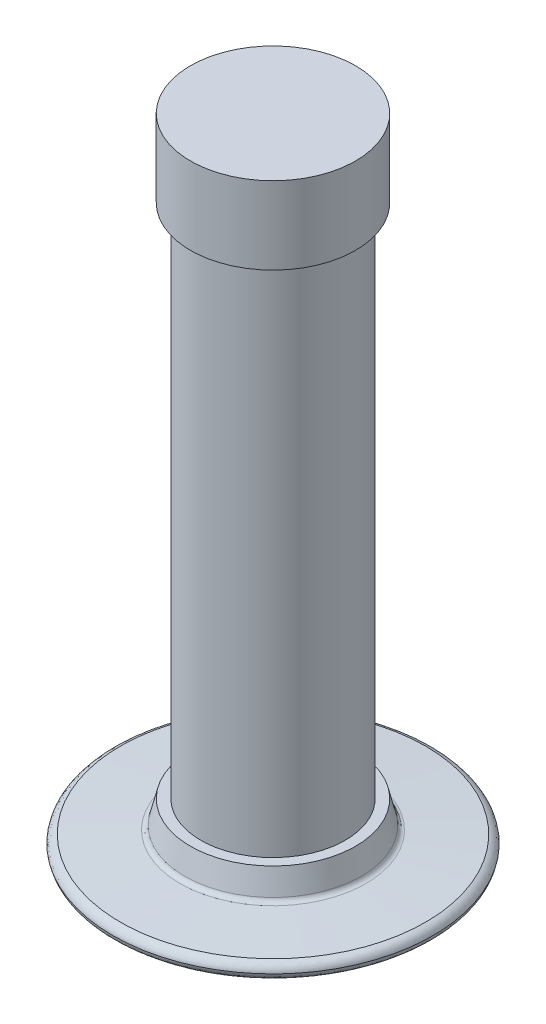
ISO-10303-21;
HEADER;
FILE_DESCRIPTION(('STEP AP214'),'2;1');
FILE_NAME('part.step','',(''),(''),'','','');
FILE_SCHEMA(('AUTOMOTIVE_DESIGN { 1 0 10303 214 1 1 1 1 }'));
ENDSEC;
DATA;
#1=APPLICATION_CONTEXT('core data for automotive mechanical design processes');
#2=APPLICATION_PROTOCOL_DEFINITION('international standard','automotive_design',2000,#1);
#3=PRODUCT_CONTEXT('',#1,'mechanical');
#4=PRODUCT('Part','Part','',(#3));
#5=PRODUCT_RELATED_PRODUCT_CATEGORY('part','',(#4));
#6=PRODUCT_DEFINITION_FORMATION('','',#4);
#7=PRODUCT_DEFINITION_CONTEXT('part definition',#1,'design');
#8=PRODUCT_DEFINITION('design','',#6,#7);
#9=PRODUCT_DEFINITION_SHAPE('','',#8);
#10=(LENGTH_UNIT() NAMED_UNIT(*) SI_UNIT(.MILLI.,.METRE.));
#11=(NAMED_UNIT(*) PLANE_ANGLE_UNIT() SI_UNIT($,.RADIAN.));
#12=(NAMED_UNIT(*) SI_UNIT($,.STERADIAN.) SOLID_ANGLE_UNIT());
#13=UNCERTAINTY_MEASURE_WITH_UNIT(LENGTH_MEASURE(1.E-05),#10,'distance_accuracy_value','');
#14=(GEOMETRIC_REPRESENTATION_CONTEXT(3) GLOBAL_UNCERTAINTY_ASSIGNED_CONTEXT((#13)) GLOBAL_UNIT_ASSIGNED_CONTEXT((#10,
#11,#12)) REPRESENTATION_CONTEXT('',''));
#15=CARTESIAN_POINT('',(0.,0.,0.));
#16=DIRECTION('',(0.,0.,1.));
#17=DIRECTION('',(1.,0.,0.));
#18=AXIS2_PLACEMENT_3D('',#15,#16,#17);
#19=CARTESIAN_POINT('',(0.,0.,0.));
#20=DIRECTION('',(0.,-1.,0.));
#21=DIRECTION('',(0.,0.,-1.));
#22=AXIS2_PLACEMENT_3D('',#19,#20,#21);
#23=PLANE('',#22);
#24=CARTESIAN_POINT('',(0.,0.,0.));
#25=DIRECTION('',(0.,-1.,0.));
#26=DIRECTION('',(0.,0.,-1.));
#27=AXIS2_PLACEMENT_3D('',#24,#25,#26);
#28=CIRCLE('',#27,16.);
#29=CARTESIAN_POINT('',(0.,0.,-16.));
#30=VERTEX_POINT('',#29);
#31=EDGE_CURVE('E10',#30,#30,#28,.T.);
#32=ORIENTED_EDGE('',*,*,#31,.T.);
#33=EDGE_LOOP('',(#32));
#34=FACE_BOUND('',#33,.T.);
#35=ADVANCED_FACE('F41',(#34),#23,.T.);
#36=CARTESIAN_POINT('',(0.,0.,0.));
#37=DIRECTION('',(0.,1.,0.));
#38=DIRECTION('',(0.,0.,1.));
#39=AXIS2_PLACEMENT_3D('',#36,#37,#38);
#40=CONICAL_SURFACE('',#39,16.,0.242838371393411);
#41=CARTESIAN_POINT('',(0.,4.48756890602738,0.));
#42=DIRECTION('',(0.,-1.,0.));
#43=DIRECTION('',(0.,0.,-1.));
#44=AXIS2_PLACEMENT_3D('',#41,#42,#43);
#45=CIRCLE('',#44,17.1116926676431);
#46=CARTESIAN_POINT('',(0.,4.48756890602738,-17.1116926676431));
#47=VERTEX_POINT('',#46);
#48=EDGE_CURVE('E48',#47,#47,#45,.T.);
#49=ORIENTED_EDGE('',*,*,#48,.T.);
#50=EDGE_LOOP('',(#49));
#51=FACE_BOUND('',#50,.T.);
#52=ORIENTED_EDGE('',*,*,#31,.F.);
#53=EDGE_LOOP('',(#52));
#54=FACE_BOUND('',#53,.T.);
#55=ADVANCED_FACE('F128',(#51,#54),#40,.T.);
#56=CARTESIAN_POINT('',(0.,4.2471102228884,0.));
#57=DIRECTION('',(0.,-1.,0.));
#58=DIRECTION('',(0.,0.,-1.));
#59=AXIS2_PLACEMENT_3D('',#56,#57,#58);
#60=TOROIDAL_SURFACE('',#59,18.0823520423483,1.);
#61=CARTESIAN_POINT('',(0.,5.24518085594272,0.));
#62=DIRECTION('',(0.,-1.,0.));
#63=DIRECTION('',(0.,0.,-1.));
#64=AXIS2_PLACEMENT_3D('',#61,#62,#63);
#65=CIRCLE('',#64,18.0202633039607);
#66=CARTESIAN_POINT('',(0.,5.24518085594272,-18.0202633039607));
#67=VERTEX_POINT('',#66);
#68=EDGE_CURVE('E53',#67,#67,#65,.T.);
#69=ORIENTED_EDGE('',*,*,#68,.T.);
#70=EDGE_LOOP('',(#69));
#71=FACE_BOUND('',#70,.T.);
#72=ORIENTED_EDGE('',*,*,#48,.F.);
#73=EDGE_LOOP('',(#72));
#74=FACE_BOUND('',#73,.T.);
#75=ADVANCED_FACE('F125',(#71,#74),#60,.F.);
#76=CARTESIAN_POINT('',(0.,5.24518085594272,0.));
#77=DIRECTION('',(0.,1.,0.));
#78=DIRECTION('',(0.,0.,1.));
#79=AXIS2_PLACEMENT_3D('',#76,#77,#78);
#80=CONICAL_SURFACE('',#79,18.0202633039607,1.50866762691234);
#81=CARTESIAN_POINT('',(0.,5.96333261376944,0.));
#82=DIRECTION('',(0.,-1.,0.));
#83=DIRECTION('',(0.,0.,-1.));
#84=AXIS2_PLACEMENT_3D('',#81,#82,#83);
#85=CIRCLE('',#84,29.564485302635);
#86=CARTESIAN_POINT('',(0.,5.96333261376944,-29.564485302635));
#87=VERTEX_POINT('',#86);
#88=EDGE_CURVE('E58',#87,#87,#85,.T.);
#89=ORIENTED_EDGE('',*,*,#88,.T.);
#90=EDGE_LOOP('',(#89));
#91=FACE_BOUND('',#90,.T.);
#92=ORIENTED_EDGE('',*,*,#68,.F.);
#93=EDGE_LOOP('',(#92));
#94=FACE_BOUND('',#93,.T.);
#95=ADVANCED_FACE('F121',(#91,#94),#80,.T.);
#96=CARTESIAN_POINT('',(29.564485302635,5.96333261376944,0.));
#97=CARTESIAN_POINT('',(30.8530897913063,6.38593559454517,0.));
#98=CARTESIAN_POINT('',(31.,7.5,0.));
#99=B_SPLINE_CURVE_WITH_KNOTS('',2,(#96,#97,#98),.UNSPECIFIED.,.F.,.F.,(3,3),(0.,1.),.UNSPECIFIED.);
#100=CARTESIAN_POINT('',(0.,0.,0.));
#101=DIRECTION('',(0.,-1.,0.));
#102=AXIS1_PLACEMENT('',#100,#101);
#103=SURFACE_OF_REVOLUTION('',#99,#102);
#104=CARTESIAN_POINT('',(0.,7.5,0.));
#105=DIRECTION('',(0.,-1.,0.));
#106=DIRECTION('',(0.,0.,-1.));
#107=AXIS2_PLACEMENT_3D('',#104,#105,#106);
#108=CIRCLE('',#107,31.);
#109=CARTESIAN_POINT('',(0.,7.5,-31.));
#110=VERTEX_POINT('',#109);
#111=EDGE_CURVE('E64',#110,#110,#108,.T.);
#112=ORIENTED_EDGE('',*,*,#111,.T.);
#113=EDGE_LOOP('',(#112));
#114=FACE_BOUND('',#113,.T.);
#115=ORIENTED_EDGE('',*,*,#88,.F.);
#116=EDGE_LOOP('',(#115));
#117=FACE_BOUND('',#116,.T.);
#118=ADVANCED_FACE('F116',(#114,#117),#103,.F.);
#119=CARTESIAN_POINT('',(31.,7.5,0.));
#120=CARTESIAN_POINT('',(30.8530897913062,8.61406440545483,0.));
#121=CARTESIAN_POINT('',(29.564485302635,9.03666738623056,0.));
#122=B_SPLINE_CURVE_WITH_KNOTS('',2,(#119,#120,#121),.UNSPECIFIED.,.F.,.F.,(3,3),(0.,1.),.UNSPECIFIED.);
#123=CARTESIAN_POINT('',(0.,0.,0.));
#124=DIRECTION('',(0.,-1.,0.));
#125=AXIS1_PLACEMENT('',#123,#124);
#126=SURFACE_OF_REVOLUTION('',#122,#125);
#127=CARTESIAN_POINT('',(0.,9.03666738623056,0.));
#128=DIRECTION('',(0.,-1.,0.));
#129=DIRECTION('',(0.,0.,-1.));
#130=AXIS2_PLACEMENT_3D('',#127,#128,#129);
#131=CIRCLE('',#130,29.564485302635);
#132=CARTESIAN_POINT('',(0.,9.03666738623056,-29.564485302635));
#133=VERTEX_POINT('',#132);
#134=EDGE_CURVE('E68',#133,#133,#131,.T.);
#135=ORIENTED_EDGE('',*,*,#134,.T.);
#136=EDGE_LOOP('',(#135));
#137=FACE_BOUND('',#136,.T.);
#138=ORIENTED_EDGE('',*,*,#111,.F.);
#139=EDGE_LOOP('',(#138));
#140=FACE_BOUND('',#139,.T.);
#141=ADVANCED_FACE('F111',(#137,#140),#126,.F.);
#142=CARTESIAN_POINT('',(0.,9.03666738623056,0.));
#143=DIRECTION('',(0.,-1.,0.));
#144=DIRECTION('',(0.,0.,-1.));
#145=AXIS2_PLACEMENT_3D('',#142,#143,#144);
#146=CONICAL_SURFACE('',#145,29.564485302635,1.50866762691234);
#147=CARTESIAN_POINT('',(0.,9.75481914405728,0.));
#148=DIRECTION('',(0.,-1.,0.));
#149=DIRECTION('',(0.,0.,-1.));
#150=AXIS2_PLACEMENT_3D('',#147,#148,#149);
#151=CIRCLE('',#150,18.0202633039607);
#152=CARTESIAN_POINT('',(0.,9.75481914405728,-18.0202633039607));
#153=VERTEX_POINT('',#152);
#154=EDGE_CURVE('E72',#153,#153,#151,.T.);
#155=ORIENTED_EDGE('',*,*,#154,.T.);
#156=EDGE_LOOP('',(#155));
#157=FACE_BOUND('',#156,.T.);
#158=ORIENTED_EDGE('',*,*,#134,.F.);
#159=EDGE_LOOP('',(#158));
#160=FACE_BOUND('',#159,.T.);
#161=ADVANCED_FACE('F115',(#157,#160),#146,.T.);
#162=CARTESIAN_POINT('',(0.,10.7528897771116,0.));
#163=DIRECTION('',(0.,-1.,0.));
#164=DIRECTION('',(0.,0.,-1.));
#165=AXIS2_PLACEMENT_3D('',#162,#163,#164);
#166=TOROIDAL_SURFACE('',#165,18.0823520423483,1.);
#167=CARTESIAN_POINT('',(0.,10.5124310939726,0.));
#168=DIRECTION('',(0.,-1.,0.));
#169=DIRECTION('',(0.,0.,-1.));
#170=AXIS2_PLACEMENT_3D('',#167,#168,#169);
#171=CIRCLE('',#170,17.1116926676431);
#172=CARTESIAN_POINT('',(0.,10.5124310939726,-17.1116926676431));
#173=VERTEX_POINT('',#172);
#174=EDGE_CURVE('E76',#173,#173,#171,.T.);
#175=ORIENTED_EDGE('',*,*,#174,.T.);
#176=EDGE_LOOP('',(#175));
#177=FACE_BOUND('',#176,.T.);
#178=ORIENTED_EDGE('',*,*,#154,.F.);
#179=EDGE_LOOP('',(#178));
#180=FACE_BOUND('',#179,.T.);
#181=ADVANCED_FACE('F180',(#177,#180),#166,.F.);
#182=CARTESIAN_POINT('',(0.,10.5124310939726,0.));
#183=DIRECTION('',(0.,-1.,0.));
#184=DIRECTION('',(0.,0.,-1.));
#185=AXIS2_PLACEMENT_3D('',#182,#183,#184);
#186=CONICAL_SURFACE('',#185,17.1116926676431,0.242838371393411);
#187=CARTESIAN_POINT('',(0.,15.,0.));
#188=DIRECTION('',(0.,-1.,0.));
#189=DIRECTION('',(0.,0.,-1.));
#190=AXIS2_PLACEMENT_3D('',#187,#188,#189);
#191=CIRCLE('',#190,16.);
#192=CARTESIAN_POINT('',(0.,15.,-16.));
#193=VERTEX_POINT('',#192);
#194=EDGE_CURVE('E80',#193,#193,#191,.T.);
#195=ORIENTED_EDGE('',*,*,#194,.T.);
#196=EDGE_LOOP('',(#195));
#197=FACE_BOUND('',#196,.T.);
#198=ORIENTED_EDGE('',*,*,#174,.F.);
#199=EDGE_LOOP('',(#198));
#200=FACE_BOUND('',#199,.T.);
#201=ADVANCED_FACE('F190',(#197,#200),#186,.T.);
#202=CARTESIAN_POINT('',(16.,15.,0.));
#203=DIRECTION('',(0.,1.,0.));
#204=DIRECTION('',(0.,0.,1.));
#205=AXIS2_PLACEMENT_3D('',#202,#203,#204);
#206=PLANE('',#205);
#207=CARTESIAN_POINT('',(0.,15.,0.));
#208=DIRECTION('',(0.,-1.,0.));
#209=DIRECTION('',(0.,0.,-1.));
#210=AXIS2_PLACEMENT_3D('',#207,#208,#209);
#211=CIRCLE('',#210,14.);
#212=CARTESIAN_POINT('',(0.,15.,-14.));
#213=VERTEX_POINT('',#212);
#214=EDGE_CURVE('E84',#213,#213,#211,.T.);
#215=ORIENTED_EDGE('',*,*,#214,.T.);
#216=EDGE_LOOP('',(#215));
#217=FACE_BOUND('',#216,.T.);
#218=ORIENTED_EDGE('',*,*,#194,.F.);
#219=EDGE_LOOP('',(#218));
#220=FACE_BOUND('',#219,.T.);
#221=ADVANCED_FACE('F200',(#217,#220),#206,.T.);
#222=CARTESIAN_POINT('',(0.,0.,0.));
#223=DIRECTION('',(0.,-1.,0.));
#224=DIRECTION('',(0.,0.,-1.));
#225=AXIS2_PLACEMENT_3D('',#222,#223,#224);
#226=CYLINDRICAL_SURFACE('',#225,14.);
#227=CARTESIAN_POINT('',(0.,115.,0.));
#228=DIRECTION('',(0.,-1.,0.));
#229=DIRECTION('',(0.,0.,-1.));
#230=AXIS2_PLACEMENT_3D('',#227,#228,#229);
#231=CIRCLE('',#230,14.);
#232=CARTESIAN_POINT('',(0.,115.,-14.));
#233=VERTEX_POINT('',#232);
#234=EDGE_CURVE('E88',#233,#233,#231,.T.);
#235=ORIENTED_EDGE('',*,*,#234,.T.);
#236=EDGE_LOOP('',(#235));
#237=FACE_BOUND('',#236,.T.);
#238=ORIENTED_EDGE('',*,*,#214,.F.);
#239=EDGE_LOOP('',(#238));
#240=FACE_BOUND('',#239,.T.);
#241=ADVANCED_FACE('F211',(#237,#240),#226,.T.);
#242=CARTESIAN_POINT('',(16.,115.,0.));
#243=DIRECTION('',(0.,-1.,0.));
#244=DIRECTION('',(0.,0.,-1.));
#245=AXIS2_PLACEMENT_3D('',#242,#243,#244);
#246=PLANE('',#245);
#247=CARTESIAN_POINT('',(0.,115.,0.));
#248=DIRECTION('',(0.,-1.,0.));
#249=DIRECTION('',(0.,0.,-1.));
#250=AXIS2_PLACEMENT_3D('',#247,#248,#249);
#251=CIRCLE('',#250,16.);
#252=CARTESIAN_POINT('',(0.,115.,-16.));
#253=VERTEX_POINT('',#252);
#254=EDGE_CURVE('E92',#253,#253,#251,.T.);
#255=ORIENTED_EDGE('',*,*,#254,.T.);
#256=EDGE_LOOP('',(#255));
#257=FACE_BOUND('',#256,.T.);
#258=ORIENTED_EDGE('',*,*,#234,.F.);
#259=EDGE_LOOP('',(#258));
#260=FACE_BOUND('',#259,.T.);
#261=ADVANCED_FACE('F222',(#257,#260),#246,.T.);
#262=CARTESIAN_POINT('',(0.,0.,0.));
#263=DIRECTION('',(0.,-1.,0.));
#264=DIRECTION('',(0.,0.,-1.));
#265=AXIS2_PLACEMENT_3D('',#262,#263,#264);
#266=CYLINDRICAL_SURFACE('',#265,16.);
#267=CARTESIAN_POINT('',(0.,130.,0.));
#268=DIRECTION('',(0.,-1.,0.));
#269=DIRECTION('',(0.,0.,-1.));
#270=AXIS2_PLACEMENT_3D('',#267,#268,#269);
#271=CIRCLE('',#270,16.);
#272=CARTESIAN_POINT('',(0.,130.,-16.));
#273=VERTEX_POINT('',#272);
#274=EDGE_CURVE('E96',#273,#273,#271,.T.);
#275=ORIENTED_EDGE('',*,*,#274,.T.);
#276=EDGE_LOOP('',(#275));
#277=FACE_BOUND('',#276,.T.);
#278=ORIENTED_EDGE('',*,*,#254,.F.);
#279=EDGE_LOOP('',(#278));
#280=FACE_BOUND('',#279,.T.);
#281=ADVANCED_FACE('F233',(#277,#280),#266,.T.);
#282=CARTESIAN_POINT('',(0.,130.,0.));
#283=DIRECTION('',(0.,1.,0.));
#284=DIRECTION('',(0.,0.,1.));
#285=AXIS2_PLACEMENT_3D('',#282,#283,#284);
#286=PLANE('',#285);
#287=ORIENTED_EDGE('',*,*,#274,.F.);
#288=EDGE_LOOP('',(#287));
#289=FACE_BOUND('',#288,.T.);
#290=ADVANCED_FACE('F244',(#289),#286,.T.);
#291=CLOSED_SHELL('',(#35,#55,#75,#95,#118,#141,#161,#181,#201,#221,#241,#261,#281,#290));
#292=MANIFOLD_SOLID_BREP('B2',#291);
#293=ADVANCED_BREP_SHAPE_REPRESENTATION('',(#18,#292),#14);
#294=SHAPE_DEFINITION_REPRESENTATION(#9,#293);
ENDSEC;
END-ISO-10303-21;
